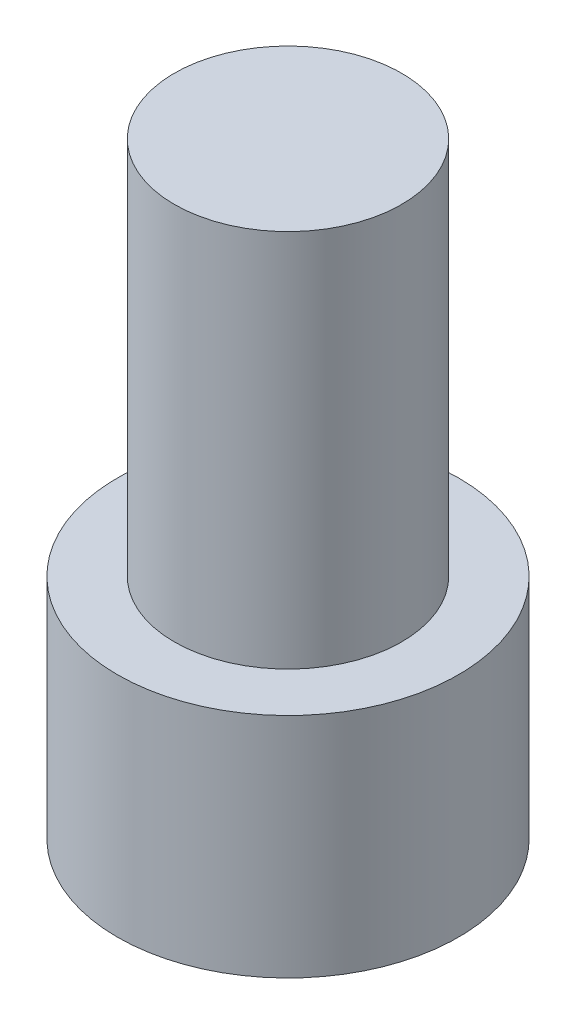
ISO-10303-21;
HEADER;
FILE_DESCRIPTION(('STEP AP214'),'2;1');
FILE_NAME('part.step','',(''),(''),'','','');
FILE_SCHEMA(('AUTOMOTIVE_DESIGN { 1 0 10303 214 1 1 1 1 }'));
ENDSEC;
DATA;
#1=APPLICATION_CONTEXT('core data for automotive mechanical design processes');
#2=APPLICATION_PROTOCOL_DEFINITION('international standard','automotive_design',2000,#1);
#3=PRODUCT_CONTEXT('',#1,'mechanical');
#4=PRODUCT('Part','Part','',(#3));
#5=PRODUCT_RELATED_PRODUCT_CATEGORY('part','',(#4));
#6=PRODUCT_DEFINITION_FORMATION('','',#4);
#7=PRODUCT_DEFINITION_CONTEXT('part definition',#1,'design');
#8=PRODUCT_DEFINITION('design','',#6,#7);
#9=PRODUCT_DEFINITION_SHAPE('','',#8);
#10=(LENGTH_UNIT() NAMED_UNIT(*) SI_UNIT(.MILLI.,.METRE.));
#11=(NAMED_UNIT(*) PLANE_ANGLE_UNIT() SI_UNIT($,.RADIAN.));
#12=(NAMED_UNIT(*) SI_UNIT($,.STERADIAN.) SOLID_ANGLE_UNIT());
#13=UNCERTAINTY_MEASURE_WITH_UNIT(LENGTH_MEASURE(1.E-05),#10,'distance_accuracy_value','');
#14=(GEOMETRIC_REPRESENTATION_CONTEXT(3) GLOBAL_UNCERTAINTY_ASSIGNED_CONTEXT((#13)) GLOBAL_UNIT_ASSIGNED_CONTEXT((#10,
#11,#12)) REPRESENTATION_CONTEXT('',''));
#15=CARTESIAN_POINT('',(0.,0.,0.));
#16=DIRECTION('',(0.,0.,1.));
#17=DIRECTION('',(1.,0.,0.));
#18=AXIS2_PLACEMENT_3D('',#15,#16,#17);
#19=CARTESIAN_POINT('',(0.,12.,0.));
#20=DIRECTION('',(0.,-1.,0.));
#21=DIRECTION('',(0.,0.,-1.));
#22=AXIS2_PLACEMENT_3D('',#19,#20,#21);
#23=CYLINDRICAL_SURFACE('',#22,9.);
#24=CARTESIAN_POINT('',(0.,12.,0.));
#25=DIRECTION('',(0.,1.,0.));
#26=DIRECTION('',(0.,0.,1.));
#27=AXIS2_PLACEMENT_3D('',#24,#25,#26);
#28=CIRCLE('',#27,9.);
#29=CARTESIAN_POINT('',(0.,12.,9.));
#30=VERTEX_POINT('',#29);
#31=EDGE_CURVE('E11',#30,#30,#28,.T.);
#32=ORIENTED_EDGE('',*,*,#31,.F.);
#33=EDGE_LOOP('',(#32));
#34=FACE_BOUND('',#33,.T.);
#35=CARTESIAN_POINT('',(0.,0.,0.));
#36=DIRECTION('',(0.,1.,0.));
#37=DIRECTION('',(0.,0.,1.));
#38=AXIS2_PLACEMENT_3D('',#35,#36,#37);
#39=CIRCLE('',#38,9.);
#40=CARTESIAN_POINT('',(0.,0.,9.));
#41=VERTEX_POINT('',#40);
#42=EDGE_CURVE('E44',#41,#41,#39,.T.);
#43=ORIENTED_EDGE('',*,*,#42,.T.);
#44=EDGE_LOOP('',(#43));
#45=FACE_BOUND('',#44,.T.);
#46=ADVANCED_FACE('F41',(#34,#45),#23,.T.);
#47=CARTESIAN_POINT('',(0.,12.,0.));
#48=DIRECTION('',(0.,1.,0.));
#49=DIRECTION('',(0.,0.,1.));
#50=AXIS2_PLACEMENT_3D('',#47,#48,#49);
#51=PLANE('',#50);
#52=CARTESIAN_POINT('',(0.,12.,0.));
#53=DIRECTION('',(0.,1.,0.));
#54=DIRECTION('',(0.,0.,1.));
#55=AXIS2_PLACEMENT_3D('',#52,#53,#54);
#56=CIRCLE('',#55,6.);
#57=CARTESIAN_POINT('',(0.,12.,6.));
#58=VERTEX_POINT('',#57);
#59=EDGE_CURVE('E150',#58,#58,#56,.F.);
#60=ORIENTED_EDGE('',*,*,#59,.T.);
#61=EDGE_LOOP('',(#60));
#62=FACE_BOUND('',#61,.T.);
#63=ORIENTED_EDGE('',*,*,#31,.T.);
#64=EDGE_LOOP('',(#63));
#65=FACE_BOUND('',#64,.T.);
#66=ADVANCED_FACE('F161',(#62,#65),#51,.T.);
#67=CARTESIAN_POINT('',(0.,0.,0.));
#68=DIRECTION('',(0.,1.,0.));
#69=DIRECTION('',(0.,0.,1.));
#70=AXIS2_PLACEMENT_3D('',#67,#68,#69);
#71=PLANE('',#70);
#72=DIRECTION('',(1.,0.,0.));
#73=VECTOR('',#72,1.);
#74=CARTESIAN_POINT('',(-3.5,0.,-6.06217782649107));
#75=LINE('',#74,#73);
#76=CARTESIAN_POINT('',(-3.5,0.,-6.06217782649107));
#77=VERTEX_POINT('',#76);
#78=CARTESIAN_POINT('',(3.5,0.,-6.06217782649107));
#79=VERTEX_POINT('',#78);
#80=EDGE_CURVE('E129',#77,#79,#75,.T.);
#81=ORIENTED_EDGE('',*,*,#80,.F.);
#82=DIRECTION('',(0.5,0.,-0.866025403784439));
#83=VECTOR('',#82,1.);
#84=CARTESIAN_POINT('',(-7.,0.,0.));
#85=LINE('',#84,#83);
#86=CARTESIAN_POINT('',(-7.,0.,0.));
#87=VERTEX_POINT('',#86);
#88=EDGE_CURVE('E55',#87,#77,#85,.T.);
#89=ORIENTED_EDGE('',*,*,#88,.F.);
#90=DIRECTION('',(-0.5,0.,-0.866025403784439));
#91=VECTOR('',#90,1.);
#92=CARTESIAN_POINT('',(-3.5,0.,6.06217782649107));
#93=LINE('',#92,#91);
#94=CARTESIAN_POINT('',(-3.5,0.,6.06217782649107));
#95=VERTEX_POINT('',#94);
#96=EDGE_CURVE('E138',#95,#87,#93,.T.);
#97=ORIENTED_EDGE('',*,*,#96,.F.);
#98=DIRECTION('',(-1.,0.,0.));
#99=VECTOR('',#98,1.);
#100=CARTESIAN_POINT('',(3.5,0.,6.06217782649107));
#101=LINE('',#100,#99);
#102=CARTESIAN_POINT('',(3.5,0.,6.06217782649107));
#103=VERTEX_POINT('',#102);
#104=EDGE_CURVE('E136',#103,#95,#101,.T.);
#105=ORIENTED_EDGE('',*,*,#104,.F.);
#106=DIRECTION('',(-0.500000000000001,0.,0.866025403784438));
#107=VECTOR('',#106,1.);
#108=CARTESIAN_POINT('',(7.,0.,0.));
#109=LINE('',#108,#107);
#110=CARTESIAN_POINT('',(7.,0.,0.));
#111=VERTEX_POINT('',#110);
#112=EDGE_CURVE('E103',#111,#103,#109,.T.);
#113=ORIENTED_EDGE('',*,*,#112,.F.);
#114=DIRECTION('',(0.5,0.,0.866025403784439));
#115=VECTOR('',#114,1.);
#116=CARTESIAN_POINT('',(3.5,0.,-6.06217782649107));
#117=LINE('',#116,#115);
#118=EDGE_CURVE('E132',#79,#111,#117,.T.);
#119=ORIENTED_EDGE('',*,*,#118,.F.);
#120=EDGE_LOOP('',(#81,#89,#97,#105,#113,#119));
#121=FACE_BOUND('',#120,.T.);
#122=ORIENTED_EDGE('',*,*,#42,.F.);
#123=EDGE_LOOP('',(#122));
#124=FACE_BOUND('',#123,.T.);
#125=ADVANCED_FACE('F158',(#121,#124),#71,.F.);
#126=CARTESIAN_POINT('',(0.,32.,0.));
#127=DIRECTION('',(0.,-1.,0.));
#128=DIRECTION('',(0.,0.,-1.));
#129=AXIS2_PLACEMENT_3D('',#126,#127,#128);
#130=CYLINDRICAL_SURFACE('',#129,6.);
#131=ORIENTED_EDGE('',*,*,#59,.F.);
#132=EDGE_LOOP('',(#131));
#133=FACE_BOUND('',#132,.T.);
#134=CARTESIAN_POINT('',(0.,32.,0.));
#135=DIRECTION('',(0.,1.,0.));
#136=DIRECTION('',(0.,0.,1.));
#137=AXIS2_PLACEMENT_3D('',#134,#135,#136);
#138=CIRCLE('',#137,6.);
#139=CARTESIAN_POINT('',(0.,32.,6.));
#140=VERTEX_POINT('',#139);
#141=EDGE_CURVE('E142',#140,#140,#138,.T.);
#142=ORIENTED_EDGE('',*,*,#141,.F.);
#143=EDGE_LOOP('',(#142));
#144=FACE_BOUND('',#143,.T.);
#145=ADVANCED_FACE('F160',(#133,#144),#130,.T.);
#146=CARTESIAN_POINT('',(0.,32.,0.));
#147=DIRECTION('',(0.,1.,0.));
#148=DIRECTION('',(0.,0.,1.));
#149=AXIS2_PLACEMENT_3D('',#146,#147,#148);
#150=PLANE('',#149);
#151=ORIENTED_EDGE('',*,*,#141,.T.);
#152=EDGE_LOOP('',(#151));
#153=FACE_BOUND('',#152,.T.);
#154=ADVANCED_FACE('F167',(#153),#150,.T.);
#155=CARTESIAN_POINT('',(-7.,6.,0.));
#156=DIRECTION('',(-0.866025403784439,0.,-0.5));
#157=DIRECTION('',(-0.5,0.,0.866025403784439));
#158=AXIS2_PLACEMENT_3D('',#155,#156,#157);
#159=PLANE('',#158);
#160=ORIENTED_EDGE('',*,*,#88,.T.);
#161=DIRECTION('',(0.,-1.,0.));
#162=VECTOR('',#161,1.);
#163=CARTESIAN_POINT('',(-3.5,6.,-6.06217782649107));
#164=LINE('',#163,#162);
#165=CARTESIAN_POINT('',(-3.5,6.,-6.06217782649107));
#166=VERTEX_POINT('',#165);
#167=EDGE_CURVE('E85',#166,#77,#164,.T.);
#168=ORIENTED_EDGE('',*,*,#167,.F.);
#169=DIRECTION('',(0.5,0.,-0.866025403784439));
#170=VECTOR('',#169,1.);
#171=CARTESIAN_POINT('',(-7.,6.,0.));
#172=LINE('',#171,#170);
#173=CARTESIAN_POINT('',(-7.,6.,0.));
#174=VERTEX_POINT('',#173);
#175=EDGE_CURVE('E140',#174,#166,#172,.T.);
#176=ORIENTED_EDGE('',*,*,#175,.F.);
#177=DIRECTION('',(0.,-1.,0.));
#178=VECTOR('',#177,1.);
#179=CARTESIAN_POINT('',(-7.,6.,0.));
#180=LINE('',#179,#178);
#181=EDGE_CURVE('E63',#174,#87,#180,.T.);
#182=ORIENTED_EDGE('',*,*,#181,.T.);
#183=EDGE_LOOP('',(#160,#168,#176,#182));
#184=FACE_BOUND('',#183,.T.);
#185=ADVANCED_FACE('F202',(#184),#159,.F.);
#186=CARTESIAN_POINT('',(-3.5,6.,6.06217782649107));
#187=DIRECTION('',(-0.866025403784439,0.,0.5));
#188=DIRECTION('',(0.5,0.,0.866025403784439));
#189=AXIS2_PLACEMENT_3D('',#186,#187,#188);
#190=PLANE('',#189);
#191=ORIENTED_EDGE('',*,*,#96,.T.);
#192=ORIENTED_EDGE('',*,*,#181,.F.);
#193=DIRECTION('',(-0.5,0.,-0.866025403784439));
#194=VECTOR('',#193,1.);
#195=CARTESIAN_POINT('',(-3.5,6.,6.06217782649107));
#196=LINE('',#195,#194);
#197=CARTESIAN_POINT('',(-3.5,6.,6.06217782649107));
#198=VERTEX_POINT('',#197);
#199=EDGE_CURVE('E115',#198,#174,#196,.T.);
#200=ORIENTED_EDGE('',*,*,#199,.F.);
#201=DIRECTION('',(0.,-1.,0.));
#202=VECTOR('',#201,1.);
#203=CARTESIAN_POINT('',(-3.5,6.,6.06217782649107));
#204=LINE('',#203,#202);
#205=EDGE_CURVE('E107',#198,#95,#204,.T.);
#206=ORIENTED_EDGE('',*,*,#205,.T.);
#207=EDGE_LOOP('',(#191,#192,#200,#206));
#208=FACE_BOUND('',#207,.T.);
#209=ADVANCED_FACE('F219',(#208),#190,.F.);
#210=CARTESIAN_POINT('',(3.5,6.,6.06217782649107));
#211=DIRECTION('',(0.,0.,1.));
#212=DIRECTION('',(1.,0.,0.));
#213=AXIS2_PLACEMENT_3D('',#210,#211,#212);
#214=PLANE('',#213);
#215=ORIENTED_EDGE('',*,*,#104,.T.);
#216=ORIENTED_EDGE('',*,*,#205,.F.);
#217=DIRECTION('',(-1.,0.,0.));
#218=VECTOR('',#217,1.);
#219=CARTESIAN_POINT('',(3.5,6.,6.06217782649107));
#220=LINE('',#219,#218);
#221=CARTESIAN_POINT('',(3.5,6.,6.06217782649107));
#222=VERTEX_POINT('',#221);
#223=EDGE_CURVE('E111',#222,#198,#220,.T.);
#224=ORIENTED_EDGE('',*,*,#223,.F.);
#225=DIRECTION('',(0.,-1.,0.));
#226=VECTOR('',#225,1.);
#227=CARTESIAN_POINT('',(3.5,6.,6.06217782649107));
#228=LINE('',#227,#226);
#229=EDGE_CURVE('E96',#222,#103,#228,.T.);
#230=ORIENTED_EDGE('',*,*,#229,.T.);
#231=EDGE_LOOP('',(#215,#216,#224,#230));
#232=FACE_BOUND('',#231,.T.);
#233=ADVANCED_FACE('F112',(#232),#214,.F.);
#234=CARTESIAN_POINT('',(7.,6.,0.));
#235=DIRECTION('',(0.866025403784438,0.,0.500000000000001));
#236=DIRECTION('',(0.500000000000001,0.,-0.866025403784438));
#237=AXIS2_PLACEMENT_3D('',#234,#235,#236);
#238=PLANE('',#237);
#239=ORIENTED_EDGE('',*,*,#112,.T.);
#240=ORIENTED_EDGE('',*,*,#229,.F.);
#241=DIRECTION('',(-0.500000000000001,0.,0.866025403784438));
#242=VECTOR('',#241,1.);
#243=CARTESIAN_POINT('',(7.,6.,0.));
#244=LINE('',#243,#242);
#245=CARTESIAN_POINT('',(7.,6.,0.));
#246=VERTEX_POINT('',#245);
#247=EDGE_CURVE('E100',#246,#222,#244,.T.);
#248=ORIENTED_EDGE('',*,*,#247,.F.);
#249=DIRECTION('',(0.,-1.,0.));
#250=VECTOR('',#249,1.);
#251=CARTESIAN_POINT('',(7.,6.,0.));
#252=LINE('',#251,#250);
#253=EDGE_CURVE('E108',#246,#111,#252,.T.);
#254=ORIENTED_EDGE('',*,*,#253,.T.);
#255=EDGE_LOOP('',(#239,#240,#248,#254));
#256=FACE_BOUND('',#255,.T.);
#257=ADVANCED_FACE('F98',(#256),#238,.F.);
#258=CARTESIAN_POINT('',(3.5,6.,-6.06217782649107));
#259=DIRECTION('',(0.866025403784439,0.,-0.5));
#260=DIRECTION('',(-0.5,0.,-0.866025403784439));
#261=AXIS2_PLACEMENT_3D('',#258,#259,#260);
#262=PLANE('',#261);
#263=ORIENTED_EDGE('',*,*,#118,.T.);
#264=ORIENTED_EDGE('',*,*,#253,.F.);
#265=DIRECTION('',(0.5,0.,0.866025403784439));
#266=VECTOR('',#265,1.);
#267=CARTESIAN_POINT('',(3.5,6.,-6.06217782649107));
#268=LINE('',#267,#266);
#269=CARTESIAN_POINT('',(3.5,6.,-6.06217782649107));
#270=VERTEX_POINT('',#269);
#271=EDGE_CURVE('E121',#270,#246,#268,.T.);
#272=ORIENTED_EDGE('',*,*,#271,.F.);
#273=DIRECTION('',(0.,-1.,0.));
#274=VECTOR('',#273,1.);
#275=CARTESIAN_POINT('',(3.5,6.,-6.06217782649107));
#276=LINE('',#275,#274);
#277=EDGE_CURVE('E145',#270,#79,#276,.T.);
#278=ORIENTED_EDGE('',*,*,#277,.T.);
#279=EDGE_LOOP('',(#263,#264,#272,#278));
#280=FACE_BOUND('',#279,.T.);
#281=ADVANCED_FACE('F247',(#280),#262,.F.);
#282=CARTESIAN_POINT('',(-3.5,6.,-6.06217782649107));
#283=DIRECTION('',(0.,0.,-1.));
#284=DIRECTION('',(-1.,0.,0.));
#285=AXIS2_PLACEMENT_3D('',#282,#283,#284);
#286=PLANE('',#285);
#287=ORIENTED_EDGE('',*,*,#80,.T.);
#288=ORIENTED_EDGE('',*,*,#277,.F.);
#289=DIRECTION('',(1.,0.,0.));
#290=VECTOR('',#289,1.);
#291=CARTESIAN_POINT('',(-3.5,6.,-6.06217782649107));
#292=LINE('',#291,#290);
#293=EDGE_CURVE('E123',#166,#270,#292,.T.);
#294=ORIENTED_EDGE('',*,*,#293,.F.);
#295=ORIENTED_EDGE('',*,*,#167,.T.);
#296=EDGE_LOOP('',(#287,#288,#294,#295));
#297=FACE_BOUND('',#296,.T.);
#298=ADVANCED_FACE('F257',(#297),#286,.F.);
#299=CARTESIAN_POINT('',(0.,6.,0.));
#300=DIRECTION('',(0.,-1.,0.));
#301=DIRECTION('',(0.,0.,-1.));
#302=AXIS2_PLACEMENT_3D('',#299,#300,#301);
#303=PLANE('',#302);
#304=ORIENTED_EDGE('',*,*,#175,.T.);
#305=ORIENTED_EDGE('',*,*,#293,.T.);
#306=ORIENTED_EDGE('',*,*,#271,.T.);
#307=ORIENTED_EDGE('',*,*,#247,.T.);
#308=ORIENTED_EDGE('',*,*,#223,.T.);
#309=ORIENTED_EDGE('',*,*,#199,.T.);
#310=EDGE_LOOP('',(#304,#305,#306,#307,#308,#309));
#311=FACE_BOUND('',#310,.T.);
#312=ADVANCED_FACE('F118',(#311),#303,.T.);
#313=CLOSED_SHELL('',(#46,#66,#125,#145,#154,#185,#209,#233,#257,#281,#298,#312));
#314=MANIFOLD_SOLID_BREP('B2',#313);
#315=ADVANCED_BREP_SHAPE_REPRESENTATION('',(#18,#314),#14);
#316=SHAPE_DEFINITION_REPRESENTATION(#9,#315);
ENDSEC;
END-ISO-10303-21;
